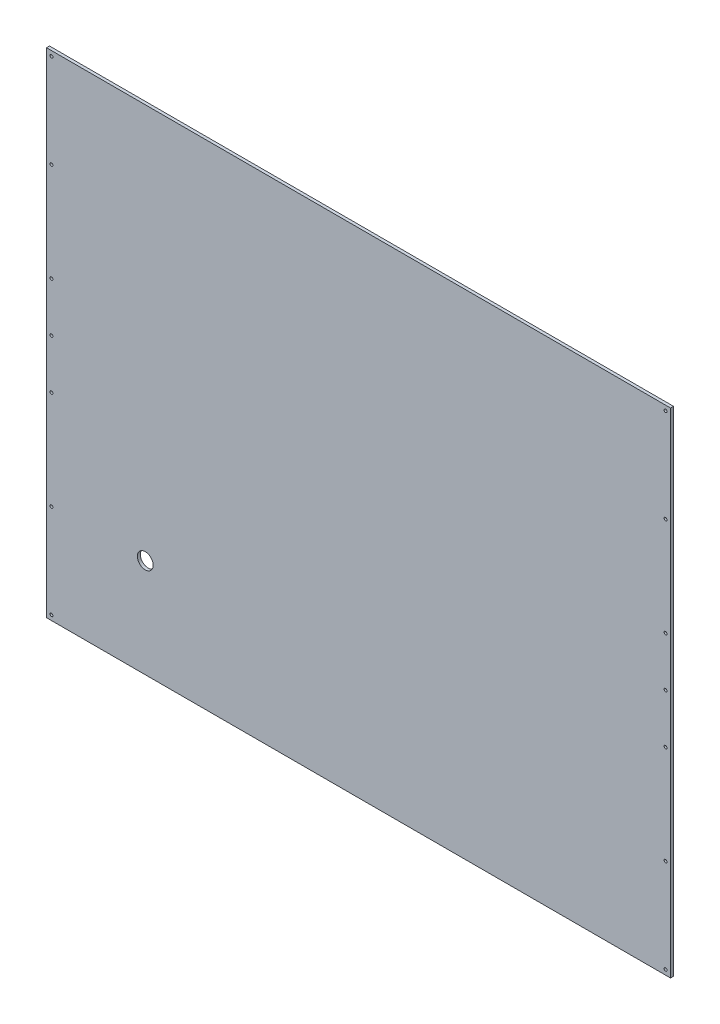
ISO-10303-21;
HEADER;
FILE_DESCRIPTION(('STEP AP214'),'2;1');
FILE_NAME('part.step','',(''),(''),'','','');
FILE_SCHEMA(('AUTOMOTIVE_DESIGN { 1 0 10303 214 1 1 1 1 }'));
ENDSEC;
DATA;
#1=APPLICATION_CONTEXT('core data for automotive mechanical design processes');
#2=APPLICATION_PROTOCOL_DEFINITION('international standard','automotive_design',2000,#1);
#3=PRODUCT_CONTEXT('',#1,'mechanical');
#4=PRODUCT('Part','Part','',(#3));
#5=PRODUCT_RELATED_PRODUCT_CATEGORY('part','',(#4));
#6=PRODUCT_DEFINITION_FORMATION('','',#4);
#7=PRODUCT_DEFINITION_CONTEXT('part definition',#1,'design');
#8=PRODUCT_DEFINITION('design','',#6,#7);
#9=PRODUCT_DEFINITION_SHAPE('','',#8);
#10=(LENGTH_UNIT() NAMED_UNIT(*) SI_UNIT(.MILLI.,.METRE.));
#11=(NAMED_UNIT(*) PLANE_ANGLE_UNIT() SI_UNIT($,.RADIAN.));
#12=(NAMED_UNIT(*) SI_UNIT($,.STERADIAN.) SOLID_ANGLE_UNIT());
#13=UNCERTAINTY_MEASURE_WITH_UNIT(LENGTH_MEASURE(1.E-05),#10,'distance_accuracy_value','');
#14=(GEOMETRIC_REPRESENTATION_CONTEXT(3) GLOBAL_UNCERTAINTY_ASSIGNED_CONTEXT((#13)) GLOBAL_UNIT_ASSIGNED_CONTEXT((#10,
#11,#12)) REPRESENTATION_CONTEXT('',''));
#15=CARTESIAN_POINT('',(0.,0.,0.));
#16=DIRECTION('',(0.,0.,1.));
#17=DIRECTION('',(1.,0.,0.));
#18=AXIS2_PLACEMENT_3D('',#15,#16,#17);
#19=CARTESIAN_POINT('',(0.,0.,3.));
#20=DIRECTION('',(0.,0.,-1.));
#21=DIRECTION('',(-1.,0.,0.));
#22=AXIS2_PLACEMENT_3D('',#19,#20,#21);
#23=PLANE('',#22);
#24=DIRECTION('',(0.,-1.,0.));
#25=VECTOR('',#24,1.);
#26=CARTESIAN_POINT('',(0.,0.,3.));
#27=LINE('',#26,#25);
#28=CARTESIAN_POINT('',(0.,500.,3.));
#29=VERTEX_POINT('',#28);
#30=CARTESIAN_POINT('',(0.,0.,3.));
#31=VERTEX_POINT('',#30);
#32=EDGE_CURVE('E87',#29,#31,#27,.T.);
#33=ORIENTED_EDGE('',*,*,#32,.T.);
#34=DIRECTION('',(1.,0.,0.));
#35=VECTOR('',#34,1.);
#36=CARTESIAN_POINT('',(0.,0.,3.));
#37=LINE('',#36,#35);
#38=CARTESIAN_POINT('',(632.,0.,3.));
#39=VERTEX_POINT('',#38);
#40=EDGE_CURVE('E82',#31,#39,#37,.T.);
#41=ORIENTED_EDGE('',*,*,#40,.T.);
#42=DIRECTION('',(0.,1.,0.));
#43=VECTOR('',#42,1.);
#44=CARTESIAN_POINT('',(632.,0.,3.));
#45=LINE('',#44,#43);
#46=CARTESIAN_POINT('',(632.,500.,3.));
#47=VERTEX_POINT('',#46);
#48=EDGE_CURVE('E85',#39,#47,#45,.T.);
#49=ORIENTED_EDGE('',*,*,#48,.T.);
#50=DIRECTION('',(-1.,0.,0.));
#51=VECTOR('',#50,1.);
#52=CARTESIAN_POINT('',(0.,500.,3.));
#53=LINE('',#52,#51);
#54=EDGE_CURVE('E52',#47,#29,#53,.T.);
#55=ORIENTED_EDGE('',*,*,#54,.T.);
#56=EDGE_LOOP('',(#33,#41,#49,#55));
#57=FACE_BOUND('',#56,.T.);
#58=CARTESIAN_POINT('',(627.,250.,3.));
#59=DIRECTION('',(0.,0.,1.));
#60=DIRECTION('',(1.,0.,0.));
#61=AXIS2_PLACEMENT_3D('',#58,#59,#60);
#62=CIRCLE('',#61,1.49999999999997);
#63=CARTESIAN_POINT('',(628.5,250.,3.));
#64=VERTEX_POINT('',#63);
#65=EDGE_CURVE('E102',#64,#64,#62,.T.);
#66=ORIENTED_EDGE('',*,*,#65,.F.);
#67=EDGE_LOOP('',(#66));
#68=FACE_BOUND('',#67,.T.);
#69=CARTESIAN_POINT('',(627.,300.,3.));
#70=DIRECTION('',(0.,0.,1.));
#71=DIRECTION('',(1.,0.,0.));
#72=AXIS2_PLACEMENT_3D('',#69,#70,#71);
#73=CIRCLE('',#72,1.49999999999997);
#74=CARTESIAN_POINT('',(628.5,300.,3.));
#75=VERTEX_POINT('',#74);
#76=EDGE_CURVE('E117',#75,#75,#73,.T.);
#77=ORIENTED_EDGE('',*,*,#76,.F.);
#78=EDGE_LOOP('',(#77));
#79=FACE_BOUND('',#78,.T.);
#80=CARTESIAN_POINT('',(627.,4.99999999999995,3.));
#81=DIRECTION('',(0.,0.,1.));
#82=DIRECTION('',(-1.,0.,0.));
#83=AXIS2_PLACEMENT_3D('',#80,#81,#82);
#84=CIRCLE('',#83,1.49999999999997);
#85=CARTESIAN_POINT('',(625.5,4.99999999999995,3.));
#86=VERTEX_POINT('',#85);
#87=EDGE_CURVE('E123',#86,#86,#84,.T.);
#88=ORIENTED_EDGE('',*,*,#87,.F.);
#89=EDGE_LOOP('',(#88));
#90=FACE_BOUND('',#89,.T.);
#91=CARTESIAN_POINT('',(627.,400.,3.));
#92=DIRECTION('',(0.,0.,1.));
#93=DIRECTION('',(1.,0.,0.));
#94=AXIS2_PLACEMENT_3D('',#91,#92,#93);
#95=CIRCLE('',#94,1.49999999999997);
#96=CARTESIAN_POINT('',(628.5,400.,3.));
#97=VERTEX_POINT('',#96);
#98=EDGE_CURVE('E129',#97,#97,#95,.T.);
#99=ORIENTED_EDGE('',*,*,#98,.F.);
#100=EDGE_LOOP('',(#99));
#101=FACE_BOUND('',#100,.T.);
#102=CARTESIAN_POINT('',(627.,99.9999999999999,3.));
#103=DIRECTION('',(0.,0.,1.));
#104=DIRECTION('',(-1.,0.,0.));
#105=AXIS2_PLACEMENT_3D('',#102,#103,#104);
#106=CIRCLE('',#105,1.49999999999997);
#107=CARTESIAN_POINT('',(625.5,99.9999999999999,3.));
#108=VERTEX_POINT('',#107);
#109=EDGE_CURVE('E135',#108,#108,#106,.T.);
#110=ORIENTED_EDGE('',*,*,#109,.F.);
#111=EDGE_LOOP('',(#110));
#112=FACE_BOUND('',#111,.T.);
#113=CARTESIAN_POINT('',(627.,495.,3.));
#114=DIRECTION('',(0.,0.,1.));
#115=DIRECTION('',(1.,0.,0.));
#116=AXIS2_PLACEMENT_3D('',#113,#114,#115);
#117=CIRCLE('',#116,1.49999999999997);
#118=CARTESIAN_POINT('',(628.5,495.,3.));
#119=VERTEX_POINT('',#118);
#120=EDGE_CURVE('E141',#119,#119,#117,.T.);
#121=ORIENTED_EDGE('',*,*,#120,.F.);
#122=EDGE_LOOP('',(#121));
#123=FACE_BOUND('',#122,.T.);
#124=CARTESIAN_POINT('',(627.,200.,3.));
#125=DIRECTION('',(0.,0.,1.));
#126=DIRECTION('',(-1.,0.,0.));
#127=AXIS2_PLACEMENT_3D('',#124,#125,#126);
#128=CIRCLE('',#127,1.49999999999997);
#129=CARTESIAN_POINT('',(625.5,200.,3.));
#130=VERTEX_POINT('',#129);
#131=EDGE_CURVE('E147',#130,#130,#128,.T.);
#132=ORIENTED_EDGE('',*,*,#131,.F.);
#133=EDGE_LOOP('',(#132));
#134=FACE_BOUND('',#133,.T.);
#135=CARTESIAN_POINT('',(5.,200.,3.));
#136=DIRECTION('',(0.,0.,1.));
#137=DIRECTION('',(1.,0.,0.));
#138=AXIS2_PLACEMENT_3D('',#135,#136,#137);
#139=CIRCLE('',#138,1.49999999999997);
#140=CARTESIAN_POINT('',(6.49999999999998,200.,3.));
#141=VERTEX_POINT('',#140);
#142=EDGE_CURVE('E153',#141,#141,#139,.T.);
#143=ORIENTED_EDGE('',*,*,#142,.F.);
#144=EDGE_LOOP('',(#143));
#145=FACE_BOUND('',#144,.T.);
#146=CARTESIAN_POINT('',(5.,99.9999999999999,3.));
#147=DIRECTION('',(0.,0.,1.));
#148=DIRECTION('',(1.,0.,0.));
#149=AXIS2_PLACEMENT_3D('',#146,#147,#148);
#150=CIRCLE('',#149,1.49999999999997);
#151=CARTESIAN_POINT('',(6.49999999999998,99.9999999999999,3.));
#152=VERTEX_POINT('',#151);
#153=EDGE_CURVE('E159',#152,#152,#150,.T.);
#154=ORIENTED_EDGE('',*,*,#153,.F.);
#155=EDGE_LOOP('',(#154));
#156=FACE_BOUND('',#155,.T.);
#157=CARTESIAN_POINT('',(4.99999999999989,4.99999999999995,3.));
#158=DIRECTION('',(0.,0.,1.));
#159=DIRECTION('',(1.,0.,0.));
#160=AXIS2_PLACEMENT_3D('',#157,#158,#159);
#161=CIRCLE('',#160,1.49999999999997);
#162=CARTESIAN_POINT('',(6.49999999999986,4.99999999999995,3.));
#163=VERTEX_POINT('',#162);
#164=EDGE_CURVE('E165',#163,#163,#161,.T.);
#165=ORIENTED_EDGE('',*,*,#164,.F.);
#166=EDGE_LOOP('',(#165));
#167=FACE_BOUND('',#166,.T.);
#168=CARTESIAN_POINT('',(5.,495.,3.));
#169=DIRECTION('',(0.,0.,1.));
#170=DIRECTION('',(-1.,0.,0.));
#171=AXIS2_PLACEMENT_3D('',#168,#169,#170);
#172=CIRCLE('',#171,1.49999999999997);
#173=CARTESIAN_POINT('',(3.50000000000003,495.,3.));
#174=VERTEX_POINT('',#173);
#175=EDGE_CURVE('E171',#174,#174,#172,.T.);
#176=ORIENTED_EDGE('',*,*,#175,.F.);
#177=EDGE_LOOP('',(#176));
#178=FACE_BOUND('',#177,.T.);
#179=CARTESIAN_POINT('',(5.,400.,3.));
#180=DIRECTION('',(0.,0.,1.));
#181=DIRECTION('',(-1.,0.,0.));
#182=AXIS2_PLACEMENT_3D('',#179,#180,#181);
#183=CIRCLE('',#182,1.49999999999997);
#184=CARTESIAN_POINT('',(3.50000000000003,400.,3.));
#185=VERTEX_POINT('',#184);
#186=EDGE_CURVE('E177',#185,#185,#183,.T.);
#187=ORIENTED_EDGE('',*,*,#186,.F.);
#188=EDGE_LOOP('',(#187));
#189=FACE_BOUND('',#188,.T.);
#190=CARTESIAN_POINT('',(5.,300.,3.));
#191=DIRECTION('',(0.,0.,1.));
#192=DIRECTION('',(-1.,0.,0.));
#193=AXIS2_PLACEMENT_3D('',#190,#191,#192);
#194=CIRCLE('',#193,1.49999999999997);
#195=CARTESIAN_POINT('',(3.50000000000003,300.,3.));
#196=VERTEX_POINT('',#195);
#197=EDGE_CURVE('E183',#196,#196,#194,.T.);
#198=ORIENTED_EDGE('',*,*,#197,.F.);
#199=EDGE_LOOP('',(#198));
#200=FACE_BOUND('',#199,.T.);
#201=CARTESIAN_POINT('',(5.,250.,3.));
#202=DIRECTION('',(0.,0.,1.));
#203=DIRECTION('',(-1.,0.,0.));
#204=AXIS2_PLACEMENT_3D('',#201,#202,#203);
#205=CIRCLE('',#204,1.49999999999997);
#206=CARTESIAN_POINT('',(3.50000000000003,250.,3.));
#207=VERTEX_POINT('',#206);
#208=EDGE_CURVE('E189',#207,#207,#205,.T.);
#209=ORIENTED_EDGE('',*,*,#208,.F.);
#210=EDGE_LOOP('',(#209));
#211=FACE_BOUND('',#210,.T.);
#212=CARTESIAN_POINT('',(100.,100.,3.));
#213=DIRECTION('',(0.,0.,1.));
#214=DIRECTION('',(1.,0.,0.));
#215=AXIS2_PLACEMENT_3D('',#212,#213,#214);
#216=CIRCLE('',#215,8.00000000000001);
#217=CARTESIAN_POINT('',(108.,100.,3.));
#218=VERTEX_POINT('',#217);
#219=EDGE_CURVE('E195',#218,#218,#216,.T.);
#220=ORIENTED_EDGE('',*,*,#219,.F.);
#221=EDGE_LOOP('',(#220));
#222=FACE_BOUND('',#221,.T.);
#223=ADVANCED_FACE('F35',(#57,#68,#79,#90,#101,#112,#123,#134,#145,#156,#167,#178,#189,#200,
#211,#222),#23,.F.);
#224=CARTESIAN_POINT('',(0.,0.,0.));
#225=DIRECTION('',(0.,0.,-1.));
#226=DIRECTION('',(-1.,0.,0.));
#227=AXIS2_PLACEMENT_3D('',#224,#225,#226);
#228=PLANE('',#227);
#229=CARTESIAN_POINT('',(5.,250.,0.));
#230=DIRECTION('',(0.,0.,1.));
#231=DIRECTION('',(-1.,0.,0.));
#232=AXIS2_PLACEMENT_3D('',#229,#230,#231);
#233=CIRCLE('',#232,1.49999999999997);
#234=CARTESIAN_POINT('',(3.50000000000003,250.,0.));
#235=VERTEX_POINT('',#234);
#236=EDGE_CURVE('E192',#235,#235,#233,.T.);
#237=ORIENTED_EDGE('',*,*,#236,.T.);
#238=EDGE_LOOP('',(#237));
#239=FACE_BOUND('',#238,.T.);
#240=CARTESIAN_POINT('',(5.,400.,0.));
#241=DIRECTION('',(0.,0.,1.));
#242=DIRECTION('',(-1.,0.,0.));
#243=AXIS2_PLACEMENT_3D('',#240,#241,#242);
#244=CIRCLE('',#243,1.49999999999997);
#245=CARTESIAN_POINT('',(3.50000000000003,400.,0.));
#246=VERTEX_POINT('',#245);
#247=EDGE_CURVE('E180',#246,#246,#244,.T.);
#248=ORIENTED_EDGE('',*,*,#247,.T.);
#249=EDGE_LOOP('',(#248));
#250=FACE_BOUND('',#249,.T.);
#251=CARTESIAN_POINT('',(4.99999999999989,4.99999999999995,0.));
#252=DIRECTION('',(0.,0.,1.));
#253=DIRECTION('',(1.,0.,0.));
#254=AXIS2_PLACEMENT_3D('',#251,#252,#253);
#255=CIRCLE('',#254,1.49999999999997);
#256=CARTESIAN_POINT('',(6.49999999999986,4.99999999999995,0.));
#257=VERTEX_POINT('',#256);
#258=EDGE_CURVE('E168',#257,#257,#255,.T.);
#259=ORIENTED_EDGE('',*,*,#258,.T.);
#260=EDGE_LOOP('',(#259));
#261=FACE_BOUND('',#260,.T.);
#262=CARTESIAN_POINT('',(5.,200.,0.));
#263=DIRECTION('',(0.,0.,1.));
#264=DIRECTION('',(1.,0.,0.));
#265=AXIS2_PLACEMENT_3D('',#262,#263,#264);
#266=CIRCLE('',#265,1.49999999999997);
#267=CARTESIAN_POINT('',(6.49999999999998,200.,0.));
#268=VERTEX_POINT('',#267);
#269=EDGE_CURVE('E156',#268,#268,#266,.T.);
#270=ORIENTED_EDGE('',*,*,#269,.T.);
#271=EDGE_LOOP('',(#270));
#272=FACE_BOUND('',#271,.T.);
#273=CARTESIAN_POINT('',(627.,495.,0.));
#274=DIRECTION('',(0.,0.,1.));
#275=DIRECTION('',(1.,0.,0.));
#276=AXIS2_PLACEMENT_3D('',#273,#274,#275);
#277=CIRCLE('',#276,1.49999999999997);
#278=CARTESIAN_POINT('',(628.5,495.,0.));
#279=VERTEX_POINT('',#278);
#280=EDGE_CURVE('E144',#279,#279,#277,.T.);
#281=ORIENTED_EDGE('',*,*,#280,.T.);
#282=EDGE_LOOP('',(#281));
#283=FACE_BOUND('',#282,.T.);
#284=CARTESIAN_POINT('',(627.,400.,0.));
#285=DIRECTION('',(0.,0.,1.));
#286=DIRECTION('',(1.,0.,0.));
#287=AXIS2_PLACEMENT_3D('',#284,#285,#286);
#288=CIRCLE('',#287,1.49999999999997);
#289=CARTESIAN_POINT('',(628.5,400.,0.));
#290=VERTEX_POINT('',#289);
#291=EDGE_CURVE('E132',#290,#290,#288,.T.);
#292=ORIENTED_EDGE('',*,*,#291,.T.);
#293=EDGE_LOOP('',(#292));
#294=FACE_BOUND('',#293,.T.);
#295=CARTESIAN_POINT('',(627.,300.,0.));
#296=DIRECTION('',(0.,0.,1.));
#297=DIRECTION('',(1.,0.,0.));
#298=AXIS2_PLACEMENT_3D('',#295,#296,#297);
#299=CIRCLE('',#298,1.49999999999997);
#300=CARTESIAN_POINT('',(628.5,300.,0.));
#301=VERTEX_POINT('',#300);
#302=EDGE_CURVE('E120',#301,#301,#299,.T.);
#303=ORIENTED_EDGE('',*,*,#302,.T.);
#304=EDGE_LOOP('',(#303));
#305=FACE_BOUND('',#304,.T.);
#306=DIRECTION('',(0.,-1.,0.));
#307=VECTOR('',#306,1.);
#308=CARTESIAN_POINT('',(0.,0.,0.));
#309=LINE('',#308,#307);
#310=CARTESIAN_POINT('',(0.,500.,0.));
#311=VERTEX_POINT('',#310);
#312=CARTESIAN_POINT('',(0.,0.,0.));
#313=VERTEX_POINT('',#312);
#314=EDGE_CURVE('E99',#311,#313,#309,.T.);
#315=ORIENTED_EDGE('',*,*,#314,.F.);
#316=DIRECTION('',(-1.,0.,0.));
#317=VECTOR('',#316,1.);
#318=CARTESIAN_POINT('',(0.,500.,0.));
#319=LINE('',#318,#317);
#320=CARTESIAN_POINT('',(632.,500.,0.));
#321=VERTEX_POINT('',#320);
#322=EDGE_CURVE('E75',#321,#311,#319,.T.);
#323=ORIENTED_EDGE('',*,*,#322,.F.);
#324=DIRECTION('',(0.,1.,0.));
#325=VECTOR('',#324,1.);
#326=CARTESIAN_POINT('',(632.,0.,0.));
#327=LINE('',#326,#325);
#328=CARTESIAN_POINT('',(632.,0.,0.));
#329=VERTEX_POINT('',#328);
#330=EDGE_CURVE('E69',#329,#321,#327,.T.);
#331=ORIENTED_EDGE('',*,*,#330,.F.);
#332=DIRECTION('',(1.,0.,0.));
#333=VECTOR('',#332,1.);
#334=CARTESIAN_POINT('',(0.,0.,0.));
#335=LINE('',#334,#333);
#336=EDGE_CURVE('E91',#313,#329,#335,.T.);
#337=ORIENTED_EDGE('',*,*,#336,.F.);
#338=EDGE_LOOP('',(#315,#323,#331,#337));
#339=FACE_BOUND('',#338,.T.);
#340=CARTESIAN_POINT('',(627.,250.,0.));
#341=DIRECTION('',(0.,0.,1.));
#342=DIRECTION('',(1.,0.,0.));
#343=AXIS2_PLACEMENT_3D('',#340,#341,#342);
#344=CIRCLE('',#343,1.49999999999997);
#345=CARTESIAN_POINT('',(628.5,250.,0.));
#346=VERTEX_POINT('',#345);
#347=EDGE_CURVE('E114',#346,#346,#344,.T.);
#348=ORIENTED_EDGE('',*,*,#347,.T.);
#349=EDGE_LOOP('',(#348));
#350=FACE_BOUND('',#349,.T.);
#351=CARTESIAN_POINT('',(627.,4.99999999999995,0.));
#352=DIRECTION('',(0.,0.,1.));
#353=DIRECTION('',(-1.,0.,0.));
#354=AXIS2_PLACEMENT_3D('',#351,#352,#353);
#355=CIRCLE('',#354,1.49999999999997);
#356=CARTESIAN_POINT('',(625.5,4.99999999999995,0.));
#357=VERTEX_POINT('',#356);
#358=EDGE_CURVE('E126',#357,#357,#355,.T.);
#359=ORIENTED_EDGE('',*,*,#358,.T.);
#360=EDGE_LOOP('',(#359));
#361=FACE_BOUND('',#360,.T.);
#362=CARTESIAN_POINT('',(627.,99.9999999999999,0.));
#363=DIRECTION('',(0.,0.,1.));
#364=DIRECTION('',(-1.,0.,0.));
#365=AXIS2_PLACEMENT_3D('',#362,#363,#364);
#366=CIRCLE('',#365,1.49999999999997);
#367=CARTESIAN_POINT('',(625.5,99.9999999999999,0.));
#368=VERTEX_POINT('',#367);
#369=EDGE_CURVE('E138',#368,#368,#366,.T.);
#370=ORIENTED_EDGE('',*,*,#369,.T.);
#371=EDGE_LOOP('',(#370));
#372=FACE_BOUND('',#371,.T.);
#373=CARTESIAN_POINT('',(627.,200.,0.));
#374=DIRECTION('',(0.,0.,1.));
#375=DIRECTION('',(-1.,0.,0.));
#376=AXIS2_PLACEMENT_3D('',#373,#374,#375);
#377=CIRCLE('',#376,1.49999999999997);
#378=CARTESIAN_POINT('',(625.5,200.,0.));
#379=VERTEX_POINT('',#378);
#380=EDGE_CURVE('E150',#379,#379,#377,.T.);
#381=ORIENTED_EDGE('',*,*,#380,.T.);
#382=EDGE_LOOP('',(#381));
#383=FACE_BOUND('',#382,.T.);
#384=CARTESIAN_POINT('',(5.,99.9999999999999,0.));
#385=DIRECTION('',(0.,0.,1.));
#386=DIRECTION('',(1.,0.,0.));
#387=AXIS2_PLACEMENT_3D('',#384,#385,#386);
#388=CIRCLE('',#387,1.49999999999997);
#389=CARTESIAN_POINT('',(6.49999999999998,99.9999999999999,0.));
#390=VERTEX_POINT('',#389);
#391=EDGE_CURVE('E162',#390,#390,#388,.T.);
#392=ORIENTED_EDGE('',*,*,#391,.T.);
#393=EDGE_LOOP('',(#392));
#394=FACE_BOUND('',#393,.T.);
#395=CARTESIAN_POINT('',(5.,495.,0.));
#396=DIRECTION('',(0.,0.,1.));
#397=DIRECTION('',(-1.,0.,0.));
#398=AXIS2_PLACEMENT_3D('',#395,#396,#397);
#399=CIRCLE('',#398,1.49999999999997);
#400=CARTESIAN_POINT('',(3.50000000000003,495.,0.));
#401=VERTEX_POINT('',#400);
#402=EDGE_CURVE('E174',#401,#401,#399,.T.);
#403=ORIENTED_EDGE('',*,*,#402,.T.);
#404=EDGE_LOOP('',(#403));
#405=FACE_BOUND('',#404,.T.);
#406=CARTESIAN_POINT('',(5.,300.,0.));
#407=DIRECTION('',(0.,0.,1.));
#408=DIRECTION('',(-1.,0.,0.));
#409=AXIS2_PLACEMENT_3D('',#406,#407,#408);
#410=CIRCLE('',#409,1.49999999999997);
#411=CARTESIAN_POINT('',(3.50000000000003,300.,0.));
#412=VERTEX_POINT('',#411);
#413=EDGE_CURVE('E186',#412,#412,#410,.T.);
#414=ORIENTED_EDGE('',*,*,#413,.T.);
#415=EDGE_LOOP('',(#414));
#416=FACE_BOUND('',#415,.T.);
#417=CARTESIAN_POINT('',(100.,100.,0.));
#418=DIRECTION('',(0.,0.,1.));
#419=DIRECTION('',(1.,0.,0.));
#420=AXIS2_PLACEMENT_3D('',#417,#418,#419);
#421=CIRCLE('',#420,8.00000000000001);
#422=CARTESIAN_POINT('',(108.,100.,0.));
#423=VERTEX_POINT('',#422);
#424=EDGE_CURVE('E198',#423,#423,#421,.T.);
#425=ORIENTED_EDGE('',*,*,#424,.T.);
#426=EDGE_LOOP('',(#425));
#427=FACE_BOUND('',#426,.T.);
#428=ADVANCED_FACE('F110',(#239,#250,#261,#272,#283,#294,#305,#339,#350,#361,#372,#383,#394,
#405,#416,#427),#228,.T.);
#429=CARTESIAN_POINT('',(0.,0.,3.));
#430=DIRECTION('',(1.,0.,0.));
#431=DIRECTION('',(0.,0.,-1.));
#432=AXIS2_PLACEMENT_3D('',#429,#430,#431);
#433=PLANE('',#432);
#434=ORIENTED_EDGE('',*,*,#314,.T.);
#435=DIRECTION('',(0.,0.,-1.));
#436=VECTOR('',#435,1.);
#437=CARTESIAN_POINT('',(0.,0.,3.));
#438=LINE('',#437,#436);
#439=EDGE_CURVE('E11',#31,#313,#438,.T.);
#440=ORIENTED_EDGE('',*,*,#439,.F.);
#441=ORIENTED_EDGE('',*,*,#32,.F.);
#442=DIRECTION('',(0.,0.,-1.));
#443=VECTOR('',#442,1.);
#444=CARTESIAN_POINT('',(0.,500.,3.));
#445=LINE('',#444,#443);
#446=EDGE_CURVE('E95',#29,#311,#445,.T.);
#447=ORIENTED_EDGE('',*,*,#446,.T.);
#448=EDGE_LOOP('',(#434,#440,#441,#447));
#449=FACE_BOUND('',#448,.T.);
#450=ADVANCED_FACE('F37',(#449),#433,.F.);
#451=CARTESIAN_POINT('',(0.,0.,3.));
#452=DIRECTION('',(0.,1.,0.));
#453=DIRECTION('',(0.,0.,1.));
#454=AXIS2_PLACEMENT_3D('',#451,#452,#453);
#455=PLANE('',#454);
#456=ORIENTED_EDGE('',*,*,#336,.T.);
#457=DIRECTION('',(0.,0.,-1.));
#458=VECTOR('',#457,1.);
#459=CARTESIAN_POINT('',(632.,0.,3.));
#460=LINE('',#459,#458);
#461=EDGE_CURVE('E44',#39,#329,#460,.T.);
#462=ORIENTED_EDGE('',*,*,#461,.F.);
#463=ORIENTED_EDGE('',*,*,#40,.F.);
#464=ORIENTED_EDGE('',*,*,#439,.T.);
#465=EDGE_LOOP('',(#456,#462,#463,#464));
#466=FACE_BOUND('',#465,.T.);
#467=ADVANCED_FACE('F90',(#466),#455,.F.);
#468=CARTESIAN_POINT('',(632.,0.,3.));
#469=DIRECTION('',(-1.,0.,0.));
#470=DIRECTION('',(0.,0.,1.));
#471=AXIS2_PLACEMENT_3D('',#468,#469,#470);
#472=PLANE('',#471);
#473=ORIENTED_EDGE('',*,*,#330,.T.);
#474=DIRECTION('',(0.,0.,-1.));
#475=VECTOR('',#474,1.);
#476=CARTESIAN_POINT('',(632.,500.,3.));
#477=LINE('',#476,#475);
#478=EDGE_CURVE('E92',#47,#321,#477,.T.);
#479=ORIENTED_EDGE('',*,*,#478,.F.);
#480=ORIENTED_EDGE('',*,*,#48,.F.);
#481=ORIENTED_EDGE('',*,*,#461,.T.);
#482=EDGE_LOOP('',(#473,#479,#480,#481));
#483=FACE_BOUND('',#482,.T.);
#484=ADVANCED_FACE('F93',(#483),#472,.F.);
#485=CARTESIAN_POINT('',(0.,500.,3.));
#486=DIRECTION('',(0.,-1.,0.));
#487=DIRECTION('',(0.,0.,-1.));
#488=AXIS2_PLACEMENT_3D('',#485,#486,#487);
#489=PLANE('',#488);
#490=ORIENTED_EDGE('',*,*,#322,.T.);
#491=ORIENTED_EDGE('',*,*,#446,.F.);
#492=ORIENTED_EDGE('',*,*,#54,.F.);
#493=ORIENTED_EDGE('',*,*,#478,.T.);
#494=EDGE_LOOP('',(#490,#491,#492,#493));
#495=FACE_BOUND('',#494,.T.);
#496=ADVANCED_FACE('F107',(#495),#489,.F.);
#497=CARTESIAN_POINT('',(627.,250.,3.));
#498=DIRECTION('',(0.,0.,-1.));
#499=DIRECTION('',(-1.,0.,0.));
#500=AXIS2_PLACEMENT_3D('',#497,#498,#499);
#501=CYLINDRICAL_SURFACE('',#500,1.49999999999997);
#502=ORIENTED_EDGE('',*,*,#65,.T.);
#503=EDGE_LOOP('',(#502));
#504=FACE_BOUND('',#503,.T.);
#505=ORIENTED_EDGE('',*,*,#347,.F.);
#506=EDGE_LOOP('',(#505));
#507=FACE_BOUND('',#506,.T.);
#508=ADVANCED_FACE('F215',(#504,#507),#501,.F.);
#509=CARTESIAN_POINT('',(627.,300.,3.));
#510=DIRECTION('',(0.,0.,-1.));
#511=DIRECTION('',(-1.,0.,0.));
#512=AXIS2_PLACEMENT_3D('',#509,#510,#511);
#513=CYLINDRICAL_SURFACE('',#512,1.49999999999997);
#514=ORIENTED_EDGE('',*,*,#76,.T.);
#515=EDGE_LOOP('',(#514));
#516=FACE_BOUND('',#515,.T.);
#517=ORIENTED_EDGE('',*,*,#302,.F.);
#518=EDGE_LOOP('',(#517));
#519=FACE_BOUND('',#518,.T.);
#520=ADVANCED_FACE('F261',(#516,#519),#513,.F.);
#521=CARTESIAN_POINT('',(627.,4.99999999999995,3.));
#522=DIRECTION('',(0.,0.,-1.));
#523=DIRECTION('',(-1.,0.,0.));
#524=AXIS2_PLACEMENT_3D('',#521,#522,#523);
#525=CYLINDRICAL_SURFACE('',#524,1.49999999999997);
#526=ORIENTED_EDGE('',*,*,#87,.T.);
#527=EDGE_LOOP('',(#526));
#528=FACE_BOUND('',#527,.T.);
#529=ORIENTED_EDGE('',*,*,#358,.F.);
#530=EDGE_LOOP('',(#529));
#531=FACE_BOUND('',#530,.T.);
#532=ADVANCED_FACE('F269',(#528,#531),#525,.F.);
#533=CARTESIAN_POINT('',(627.,400.,3.));
#534=DIRECTION('',(0.,0.,-1.));
#535=DIRECTION('',(-1.,0.,0.));
#536=AXIS2_PLACEMENT_3D('',#533,#534,#535);
#537=CYLINDRICAL_SURFACE('',#536,1.49999999999997);
#538=ORIENTED_EDGE('',*,*,#98,.T.);
#539=EDGE_LOOP('',(#538));
#540=FACE_BOUND('',#539,.T.);
#541=ORIENTED_EDGE('',*,*,#291,.F.);
#542=EDGE_LOOP('',(#541));
#543=FACE_BOUND('',#542,.T.);
#544=ADVANCED_FACE('F277',(#540,#543),#537,.F.);
#545=CARTESIAN_POINT('',(627.,99.9999999999999,3.));
#546=DIRECTION('',(0.,0.,-1.));
#547=DIRECTION('',(-1.,0.,0.));
#548=AXIS2_PLACEMENT_3D('',#545,#546,#547);
#549=CYLINDRICAL_SURFACE('',#548,1.49999999999997);
#550=ORIENTED_EDGE('',*,*,#109,.T.);
#551=EDGE_LOOP('',(#550));
#552=FACE_BOUND('',#551,.T.);
#553=ORIENTED_EDGE('',*,*,#369,.F.);
#554=EDGE_LOOP('',(#553));
#555=FACE_BOUND('',#554,.T.);
#556=ADVANCED_FACE('F286',(#552,#555),#549,.F.);
#557=CARTESIAN_POINT('',(627.,495.,3.));
#558=DIRECTION('',(0.,0.,-1.));
#559=DIRECTION('',(-1.,0.,0.));
#560=AXIS2_PLACEMENT_3D('',#557,#558,#559);
#561=CYLINDRICAL_SURFACE('',#560,1.49999999999997);
#562=ORIENTED_EDGE('',*,*,#120,.T.);
#563=EDGE_LOOP('',(#562));
#564=FACE_BOUND('',#563,.T.);
#565=ORIENTED_EDGE('',*,*,#280,.F.);
#566=EDGE_LOOP('',(#565));
#567=FACE_BOUND('',#566,.T.);
#568=ADVANCED_FACE('F295',(#564,#567),#561,.F.);
#569=CARTESIAN_POINT('',(627.,200.,3.));
#570=DIRECTION('',(0.,0.,-1.));
#571=DIRECTION('',(-1.,0.,0.));
#572=AXIS2_PLACEMENT_3D('',#569,#570,#571);
#573=CYLINDRICAL_SURFACE('',#572,1.49999999999997);
#574=ORIENTED_EDGE('',*,*,#131,.T.);
#575=EDGE_LOOP('',(#574));
#576=FACE_BOUND('',#575,.T.);
#577=ORIENTED_EDGE('',*,*,#380,.F.);
#578=EDGE_LOOP('',(#577));
#579=FACE_BOUND('',#578,.T.);
#580=ADVANCED_FACE('F304',(#576,#579),#573,.F.);
#581=CARTESIAN_POINT('',(5.,200.,3.));
#582=DIRECTION('',(0.,0.,-1.));
#583=DIRECTION('',(-1.,0.,0.));
#584=AXIS2_PLACEMENT_3D('',#581,#582,#583);
#585=CYLINDRICAL_SURFACE('',#584,1.49999999999997);
#586=ORIENTED_EDGE('',*,*,#142,.T.);
#587=EDGE_LOOP('',(#586));
#588=FACE_BOUND('',#587,.T.);
#589=ORIENTED_EDGE('',*,*,#269,.F.);
#590=EDGE_LOOP('',(#589));
#591=FACE_BOUND('',#590,.T.);
#592=ADVANCED_FACE('F313',(#588,#591),#585,.F.);
#593=CARTESIAN_POINT('',(5.,99.9999999999999,3.));
#594=DIRECTION('',(0.,0.,-1.));
#595=DIRECTION('',(-1.,0.,0.));
#596=AXIS2_PLACEMENT_3D('',#593,#594,#595);
#597=CYLINDRICAL_SURFACE('',#596,1.49999999999997);
#598=ORIENTED_EDGE('',*,*,#153,.T.);
#599=EDGE_LOOP('',(#598));
#600=FACE_BOUND('',#599,.T.);
#601=ORIENTED_EDGE('',*,*,#391,.F.);
#602=EDGE_LOOP('',(#601));
#603=FACE_BOUND('',#602,.T.);
#604=ADVANCED_FACE('F322',(#600,#603),#597,.F.);
#605=CARTESIAN_POINT('',(4.99999999999989,4.99999999999995,3.));
#606=DIRECTION('',(0.,0.,-1.));
#607=DIRECTION('',(-1.,0.,0.));
#608=AXIS2_PLACEMENT_3D('',#605,#606,#607);
#609=CYLINDRICAL_SURFACE('',#608,1.49999999999997);
#610=ORIENTED_EDGE('',*,*,#164,.T.);
#611=EDGE_LOOP('',(#610));
#612=FACE_BOUND('',#611,.T.);
#613=ORIENTED_EDGE('',*,*,#258,.F.);
#614=EDGE_LOOP('',(#613));
#615=FACE_BOUND('',#614,.T.);
#616=ADVANCED_FACE('F331',(#612,#615),#609,.F.);
#617=CARTESIAN_POINT('',(5.,495.,3.));
#618=DIRECTION('',(0.,0.,-1.));
#619=DIRECTION('',(-1.,0.,0.));
#620=AXIS2_PLACEMENT_3D('',#617,#618,#619);
#621=CYLINDRICAL_SURFACE('',#620,1.49999999999997);
#622=ORIENTED_EDGE('',*,*,#175,.T.);
#623=EDGE_LOOP('',(#622));
#624=FACE_BOUND('',#623,.T.);
#625=ORIENTED_EDGE('',*,*,#402,.F.);
#626=EDGE_LOOP('',(#625));
#627=FACE_BOUND('',#626,.T.);
#628=ADVANCED_FACE('F340',(#624,#627),#621,.F.);
#629=CARTESIAN_POINT('',(5.,400.,3.));
#630=DIRECTION('',(0.,0.,-1.));
#631=DIRECTION('',(-1.,0.,0.));
#632=AXIS2_PLACEMENT_3D('',#629,#630,#631);
#633=CYLINDRICAL_SURFACE('',#632,1.49999999999997);
#634=ORIENTED_EDGE('',*,*,#186,.T.);
#635=EDGE_LOOP('',(#634));
#636=FACE_BOUND('',#635,.T.);
#637=ORIENTED_EDGE('',*,*,#247,.F.);
#638=EDGE_LOOP('',(#637));
#639=FACE_BOUND('',#638,.T.);
#640=ADVANCED_FACE('F349',(#636,#639),#633,.F.);
#641=CARTESIAN_POINT('',(5.,300.,3.));
#642=DIRECTION('',(0.,0.,-1.));
#643=DIRECTION('',(-1.,0.,0.));
#644=AXIS2_PLACEMENT_3D('',#641,#642,#643);
#645=CYLINDRICAL_SURFACE('',#644,1.49999999999997);
#646=ORIENTED_EDGE('',*,*,#197,.T.);
#647=EDGE_LOOP('',(#646));
#648=FACE_BOUND('',#647,.T.);
#649=ORIENTED_EDGE('',*,*,#413,.F.);
#650=EDGE_LOOP('',(#649));
#651=FACE_BOUND('',#650,.T.);
#652=ADVANCED_FACE('F358',(#648,#651),#645,.F.);
#653=CARTESIAN_POINT('',(5.,250.,3.));
#654=DIRECTION('',(0.,0.,-1.));
#655=DIRECTION('',(-1.,0.,0.));
#656=AXIS2_PLACEMENT_3D('',#653,#654,#655);
#657=CYLINDRICAL_SURFACE('',#656,1.49999999999997);
#658=ORIENTED_EDGE('',*,*,#208,.T.);
#659=EDGE_LOOP('',(#658));
#660=FACE_BOUND('',#659,.T.);
#661=ORIENTED_EDGE('',*,*,#236,.F.);
#662=EDGE_LOOP('',(#661));
#663=FACE_BOUND('',#662,.T.);
#664=ADVANCED_FACE('F367',(#660,#663),#657,.F.);
#665=CARTESIAN_POINT('',(100.,100.,3.));
#666=DIRECTION('',(0.,0.,-1.));
#667=DIRECTION('',(-1.,0.,0.));
#668=AXIS2_PLACEMENT_3D('',#665,#666,#667);
#669=CYLINDRICAL_SURFACE('',#668,8.00000000000001);
#670=ORIENTED_EDGE('',*,*,#219,.T.);
#671=EDGE_LOOP('',(#670));
#672=FACE_BOUND('',#671,.T.);
#673=ORIENTED_EDGE('',*,*,#424,.F.);
#674=EDGE_LOOP('',(#673));
#675=FACE_BOUND('',#674,.T.);
#676=ADVANCED_FACE('F204',(#672,#675),#669,.F.);
#677=CLOSED_SHELL('',(#223,#428,#450,#467,#484,#496,#508,#520,#532,#544,#556,#568,#580,#592,
#604,#616,#628,#640,#652,#664,#676));
#678=MANIFOLD_SOLID_BREP('B2',#677);
#679=ADVANCED_BREP_SHAPE_REPRESENTATION('',(#18,#678),#14);
#680=SHAPE_DEFINITION_REPRESENTATION(#9,#679);
ENDSEC;
END-ISO-10303-21;
